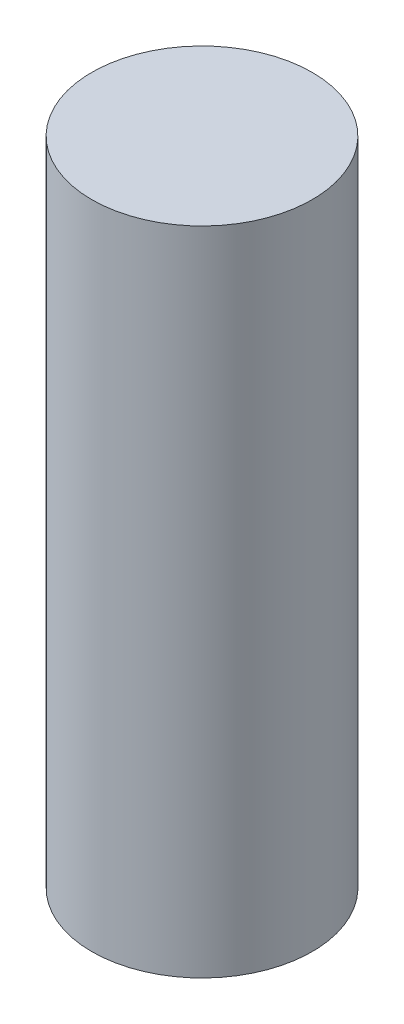
ISO-10303-21;
HEADER;
FILE_DESCRIPTION(('STEP AP214'),'2;1');
FILE_NAME('part.step','',(''),(''),'','','');
FILE_SCHEMA(('AUTOMOTIVE_DESIGN { 1 0 10303 214 1 1 1 1 }'));
ENDSEC;
DATA;
#1=APPLICATION_CONTEXT('core data for automotive mechanical design processes');
#2=APPLICATION_PROTOCOL_DEFINITION('international standard','automotive_design',2000,#1);
#3=PRODUCT_CONTEXT('',#1,'mechanical');
#4=PRODUCT('Part','Part','',(#3));
#5=PRODUCT_RELATED_PRODUCT_CATEGORY('part','',(#4));
#6=PRODUCT_DEFINITION_FORMATION('','',#4);
#7=PRODUCT_DEFINITION_CONTEXT('part definition',#1,'design');
#8=PRODUCT_DEFINITION('design','',#6,#7);
#9=PRODUCT_DEFINITION_SHAPE('','',#8);
#10=(LENGTH_UNIT() NAMED_UNIT(*) SI_UNIT(.MILLI.,.METRE.));
#11=(NAMED_UNIT(*) PLANE_ANGLE_UNIT() SI_UNIT($,.RADIAN.));
#12=(NAMED_UNIT(*) SI_UNIT($,.STERADIAN.) SOLID_ANGLE_UNIT());
#13=UNCERTAINTY_MEASURE_WITH_UNIT(LENGTH_MEASURE(1.E-05),#10,'distance_accuracy_value','');
#14=(GEOMETRIC_REPRESENTATION_CONTEXT(3) GLOBAL_UNCERTAINTY_ASSIGNED_CONTEXT((#13)) GLOBAL_UNIT_ASSIGNED_CONTEXT((#10,
#11,#12)) REPRESENTATION_CONTEXT('',''));
#15=CARTESIAN_POINT('',(0.,0.,0.));
#16=DIRECTION('',(0.,0.,1.));
#17=DIRECTION('',(1.,0.,0.));
#18=AXIS2_PLACEMENT_3D('',#15,#16,#17);
#19=CARTESIAN_POINT('',(0.,70.,0.));
#20=DIRECTION('',(0.,-1.,0.));
#21=DIRECTION('',(0.,0.,-1.));
#22=AXIS2_PLACEMENT_3D('',#19,#20,#21);
#23=CYLINDRICAL_SURFACE('',#22,11.85);
#24=CARTESIAN_POINT('',(0.,70.,0.));
#25=DIRECTION('',(0.,1.,0.));
#26=DIRECTION('',(0.,0.,1.));
#27=AXIS2_PLACEMENT_3D('',#24,#25,#26);
#28=CIRCLE('',#27,11.85);
#29=CARTESIAN_POINT('',(0.,70.,11.85));
#30=VERTEX_POINT('',#29);
#31=EDGE_CURVE('E10',#30,#30,#28,.T.);
#32=ORIENTED_EDGE('',*,*,#31,.F.);
#33=EDGE_LOOP('',(#32));
#34=FACE_BOUND('',#33,.T.);
#35=CARTESIAN_POINT('',(0.,0.,0.));
#36=DIRECTION('',(0.,1.,0.));
#37=DIRECTION('',(0.,0.,1.));
#38=AXIS2_PLACEMENT_3D('',#35,#36,#37);
#39=CIRCLE('',#38,11.85);
#40=CARTESIAN_POINT('',(0.,0.,11.85));
#41=VERTEX_POINT('',#40);
#42=EDGE_CURVE('E46',#41,#41,#39,.T.);
#43=ORIENTED_EDGE('',*,*,#42,.T.);
#44=EDGE_LOOP('',(#43));
#45=FACE_BOUND('',#44,.T.);
#46=ADVANCED_FACE('F43',(#34,#45),#23,.T.);
#47=CARTESIAN_POINT('',(0.,70.,0.));
#48=DIRECTION('',(0.,1.,0.));
#49=DIRECTION('',(0.,0.,1.));
#50=AXIS2_PLACEMENT_3D('',#47,#48,#49);
#51=PLANE('',#50);
#52=ORIENTED_EDGE('',*,*,#31,.T.);
#53=EDGE_LOOP('',(#52));
#54=FACE_BOUND('',#53,.T.);
#55=ADVANCED_FACE('F60',(#54),#51,.T.);
#56=CARTESIAN_POINT('',(0.,0.,0.));
#57=DIRECTION('',(0.,1.,0.));
#58=DIRECTION('',(0.,0.,1.));
#59=AXIS2_PLACEMENT_3D('',#56,#57,#58);
#60=PLANE('',#59);
#61=ORIENTED_EDGE('',*,*,#42,.F.);
#62=EDGE_LOOP('',(#61));
#63=FACE_BOUND('',#62,.T.);
#64=ADVANCED_FACE('F58',(#63),#60,.F.);
#65=CLOSED_SHELL('',(#46,#55,#64));
#66=MANIFOLD_SOLID_BREP('B2',#65);
#67=ADVANCED_BREP_SHAPE_REPRESENTATION('',(#18,#66),#14);
#68=SHAPE_DEFINITION_REPRESENTATION(#9,#67);
ENDSEC;
END-ISO-10303-21;
